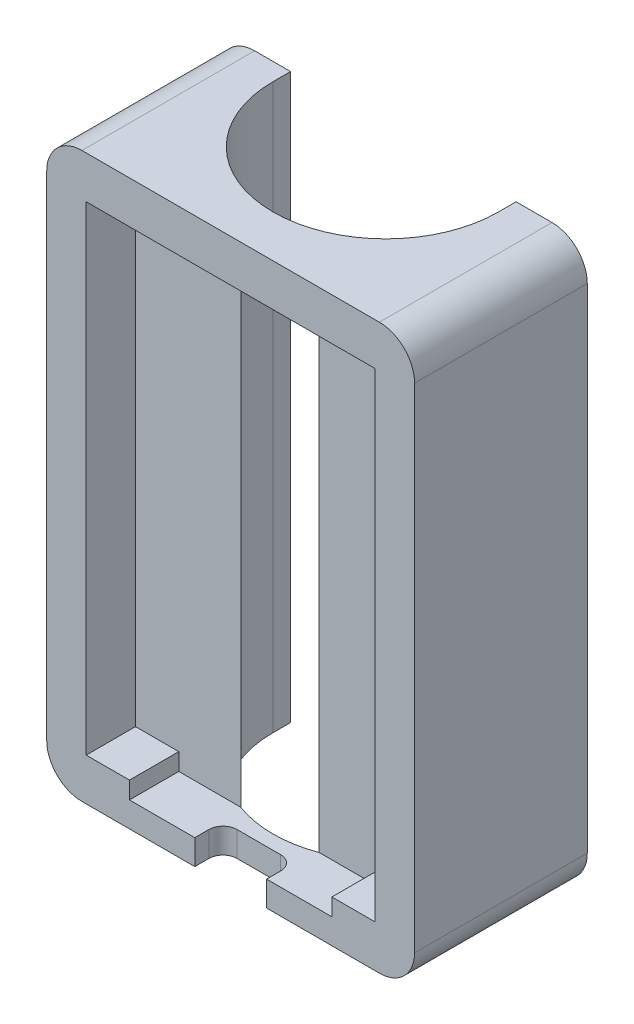
ISO-10303-21;
HEADER;
FILE_DESCRIPTION(('STEP AP214'),'2;1');
FILE_NAME('part.step','',(''),(''),'','','');
FILE_SCHEMA(('AUTOMOTIVE_DESIGN { 1 0 10303 214 1 1 1 1 }'));
ENDSEC;
DATA;
#1=APPLICATION_CONTEXT('core data for automotive mechanical design processes');
#2=APPLICATION_PROTOCOL_DEFINITION('international standard','automotive_design',2000,#1);
#3=PRODUCT_CONTEXT('',#1,'mechanical');
#4=PRODUCT('Part','Part','',(#3));
#5=PRODUCT_RELATED_PRODUCT_CATEGORY('part','',(#4));
#6=PRODUCT_DEFINITION_FORMATION('','',#4);
#7=PRODUCT_DEFINITION_CONTEXT('part definition',#1,'design');
#8=PRODUCT_DEFINITION('design','',#6,#7);
#9=PRODUCT_DEFINITION_SHAPE('','',#8);
#10=(LENGTH_UNIT() NAMED_UNIT(*) SI_UNIT(.MILLI.,.METRE.));
#11=(NAMED_UNIT(*) PLANE_ANGLE_UNIT() SI_UNIT($,.RADIAN.));
#12=(NAMED_UNIT(*) SI_UNIT($,.STERADIAN.) SOLID_ANGLE_UNIT());
#13=UNCERTAINTY_MEASURE_WITH_UNIT(LENGTH_MEASURE(1.E-05),#10,'distance_accuracy_value','');
#14=(GEOMETRIC_REPRESENTATION_CONTEXT(3) GLOBAL_UNCERTAINTY_ASSIGNED_CONTEXT((#13)) GLOBAL_UNIT_ASSIGNED_CONTEXT((#10,
#11,#12)) REPRESENTATION_CONTEXT('',''));
#15=CARTESIAN_POINT('',(0.,0.,0.));
#16=DIRECTION('',(0.,0.,1.));
#17=DIRECTION('',(1.,0.,0.));
#18=AXIS2_PLACEMENT_3D('',#15,#16,#17);
#19=CARTESIAN_POINT('',(-41.2247953621848,-2.00646090534981,22.));
#20=DIRECTION('',(1.,0.,0.));
#21=DIRECTION('',(0.,0.,-1.));
#22=AXIS2_PLACEMENT_3D('',#19,#20,#21);
#23=PLANE('',#22);
#24=DIRECTION('',(0.,1.,0.));
#25=VECTOR('',#24,1.);
#26=CARTESIAN_POINT('',(-41.2247953621848,-2.00646090534981,-2.5));
#27=LINE('',#26,#25);
#28=CARTESIAN_POINT('',(-41.2247953621848,-77.0064609053498,-2.5));
#29=VERTEX_POINT('',#28);
#30=CARTESIAN_POINT('',(-41.2247953621848,-7.00646090534981,-2.5));
#31=VERTEX_POINT('',#30);
#32=EDGE_CURVE('E271',#29,#31,#27,.T.);
#33=ORIENTED_EDGE('',*,*,#32,.F.);
#34=DIRECTION('',(0.,0.,-1.));
#35=VECTOR('',#34,1.);
#36=CARTESIAN_POINT('',(-41.2247953621848,-77.0064609053498,22.));
#37=LINE('',#36,#35);
#38=CARTESIAN_POINT('',(-41.2247953621848,-77.0064609053498,22.));
#39=VERTEX_POINT('',#38);
#40=EDGE_CURVE('E11',#29,#39,#37,.F.);
#41=ORIENTED_EDGE('',*,*,#40,.T.);
#42=DIRECTION('',(0.,-1.,0.));
#43=VECTOR('',#42,1.);
#44=CARTESIAN_POINT('',(-41.2247953621848,-2.00646090534981,22.));
#45=LINE('',#44,#43);
#46=CARTESIAN_POINT('',(-41.2247953621848,-7.00646090534981,22.));
#47=VERTEX_POINT('',#46);
#48=EDGE_CURVE('E360',#47,#39,#45,.T.);
#49=ORIENTED_EDGE('',*,*,#48,.F.);
#50=DIRECTION('',(0.,0.,-1.));
#51=VECTOR('',#50,1.);
#52=CARTESIAN_POINT('',(-41.2247953621848,-7.00646090534981,22.));
#53=LINE('',#52,#51);
#54=EDGE_CURVE('E48',#47,#31,#53,.T.);
#55=ORIENTED_EDGE('',*,*,#54,.T.);
#56=EDGE_LOOP('',(#33,#41,#49,#55));
#57=FACE_BOUND('',#56,.T.);
#58=ADVANCED_FACE('F40',(#57),#23,.F.);
#59=CARTESIAN_POINT('',(-41.2247953621848,-82.0064609053498,22.));
#60=DIRECTION('',(0.,1.,0.));
#61=DIRECTION('',(0.,0.,1.));
#62=AXIS2_PLACEMENT_3D('',#59,#60,#61);
#63=PLANE('',#62);
#64=DIRECTION('',(-1.,0.,0.));
#65=VECTOR('',#64,1.);
#66=CARTESIAN_POINT('',(10.9752046378151,-82.0064609053498,-2.5));
#67=LINE('',#66,#65);
#68=CARTESIAN_POINT('',(5.97520463781516,-82.0064609053498,-2.5));
#69=VERTEX_POINT('',#68);
#70=CARTESIAN_POINT('',(0.875204637815156,-82.0064609053498,-2.5));
#71=VERTEX_POINT('',#70);
#72=EDGE_CURVE('E261',#69,#71,#67,.T.);
#73=ORIENTED_EDGE('',*,*,#72,.F.);
#74=DIRECTION('',(0.,0.,-1.));
#75=VECTOR('',#74,1.);
#76=CARTESIAN_POINT('',(5.97520463781516,-82.0064609053498,22.));
#77=LINE('',#76,#75);
#78=CARTESIAN_POINT('',(5.97520463781516,-82.0064609053498,22.));
#79=VERTEX_POINT('',#78);
#80=EDGE_CURVE('E431',#69,#79,#77,.F.);
#81=ORIENTED_EDGE('',*,*,#80,.T.);
#82=DIRECTION('',(1.,0.,0.));
#83=VECTOR('',#82,1.);
#84=CARTESIAN_POINT('',(-41.2247953621848,-82.0064609053498,22.));
#85=LINE('',#84,#83);
#86=CARTESIAN_POINT('',(-10.0297953621848,-82.0064609053498,22.));
#87=VERTEX_POINT('',#86);
#88=EDGE_CURVE('E363',#87,#79,#85,.T.);
#89=ORIENTED_EDGE('',*,*,#88,.F.);
#90=DIRECTION('',(0.,0.,1.));
#91=VECTOR('',#90,1.);
#92=CARTESIAN_POINT('',(-10.0297953621848,-82.0064609053498,18.));
#93=LINE('',#92,#91);
#94=CARTESIAN_POINT('',(-10.0297953621848,-82.0064609053498,20.));
#95=VERTEX_POINT('',#94);
#96=EDGE_CURVE('E298',#95,#87,#93,.T.);
#97=ORIENTED_EDGE('',*,*,#96,.F.);
#98=CARTESIAN_POINT('',(-12.0297953621848,-82.0064609053498,20.));
#99=DIRECTION('',(0.,1.,0.));
#100=DIRECTION('',(0.,0.,1.));
#101=AXIS2_PLACEMENT_3D('',#98,#99,#100);
#102=CIRCLE('',#101,2.);
#103=CARTESIAN_POINT('',(-12.0297953621848,-82.0064609053498,18.));
#104=VERTEX_POINT('',#103);
#105=EDGE_CURVE('E401',#95,#104,#102,.T.);
#106=ORIENTED_EDGE('',*,*,#105,.T.);
#107=DIRECTION('',(1.,0.,0.));
#108=VECTOR('',#107,1.);
#109=CARTESIAN_POINT('',(-20.2197953621848,-82.0064609053498,18.));
#110=LINE('',#109,#108);
#111=CARTESIAN_POINT('',(-18.2197953621848,-82.0064609053498,18.));
#112=VERTEX_POINT('',#111);
#113=EDGE_CURVE('E281',#112,#104,#110,.T.);
#114=ORIENTED_EDGE('',*,*,#113,.F.);
#115=CARTESIAN_POINT('',(-18.2197953621848,-82.0064609053498,20.));
#116=DIRECTION('',(0.,1.,0.));
#117=DIRECTION('',(0.,0.,1.));
#118=AXIS2_PLACEMENT_3D('',#115,#116,#117);
#119=CIRCLE('',#118,2.);
#120=CARTESIAN_POINT('',(-20.2197953621848,-82.0064609053498,20.));
#121=VERTEX_POINT('',#120);
#122=EDGE_CURVE('E403',#112,#121,#119,.T.);
#123=ORIENTED_EDGE('',*,*,#122,.T.);
#124=DIRECTION('',(0.,0.,1.));
#125=VECTOR('',#124,1.);
#126=CARTESIAN_POINT('',(-20.2197953621848,-82.0064609053498,18.));
#127=LINE('',#126,#125);
#128=CARTESIAN_POINT('',(-20.2197953621848,-82.0064609053498,22.));
#129=VERTEX_POINT('',#128);
#130=EDGE_CURVE('E288',#121,#129,#127,.T.);
#131=ORIENTED_EDGE('',*,*,#130,.T.);
#132=CARTESIAN_POINT('',(-36.2247953621848,-82.0064609053498,22.));
#133=VERTEX_POINT('',#132);
#134=EDGE_CURVE('E364',#133,#129,#85,.T.);
#135=ORIENTED_EDGE('',*,*,#134,.F.);
#136=DIRECTION('',(0.,0.,-1.));
#137=VECTOR('',#136,1.);
#138=CARTESIAN_POINT('',(-36.2247953621848,-82.0064609053498,22.));
#139=LINE('',#138,#137);
#140=CARTESIAN_POINT('',(-36.2247953621848,-82.0064609053498,-2.5));
#141=VERTEX_POINT('',#140);
#142=EDGE_CURVE('E428',#133,#141,#139,.T.);
#143=ORIENTED_EDGE('',*,*,#142,.T.);
#144=DIRECTION('',(-1.,0.,0.));
#145=VECTOR('',#144,1.);
#146=CARTESIAN_POINT('',(-31.1247953621848,-82.0064609053498,-2.5));
#147=LINE('',#146,#145);
#148=CARTESIAN_POINT('',(-31.1247953621848,-82.0064609053498,-2.5));
#149=VERTEX_POINT('',#148);
#150=EDGE_CURVE('E269',#149,#141,#147,.T.);
#151=ORIENTED_EDGE('',*,*,#150,.F.);
#152=DIRECTION('',(0.,0.,1.));
#153=VECTOR('',#152,1.);
#154=CARTESIAN_POINT('',(-31.1247953621848,-82.0064609053498,-2.5));
#155=LINE('',#154,#153);
#156=CARTESIAN_POINT('',(-31.1247953621848,-82.0064609053498,0.));
#157=VERTEX_POINT('',#156);
#158=EDGE_CURVE('E277',#149,#157,#155,.T.);
#159=ORIENTED_EDGE('',*,*,#158,.T.);
#160=CARTESIAN_POINT('',(-15.1247953621848,-82.0064609053498,0.));
#161=DIRECTION('',(0.,-1.,0.));
#162=DIRECTION('',(0.,0.,-1.));
#163=AXIS2_PLACEMENT_3D('',#160,#161,#162);
#164=CIRCLE('',#163,16.);
#165=CARTESIAN_POINT('',(0.875204637815156,-82.0064609053498,0.));
#166=VERTEX_POINT('',#165);
#167=EDGE_CURVE('E237',#166,#157,#164,.T.);
#168=ORIENTED_EDGE('',*,*,#167,.F.);
#169=DIRECTION('',(0.,0.,1.));
#170=VECTOR('',#169,1.);
#171=CARTESIAN_POINT('',(0.875204637815156,-82.0064609053498,-2.5));
#172=LINE('',#171,#170);
#173=EDGE_CURVE('E247',#71,#166,#172,.T.);
#174=ORIENTED_EDGE('',*,*,#173,.F.);
#175=EDGE_LOOP('',(#73,#81,#89,#97,#106,#114,#123,#131,#135,#143,#151,#159,#168,#174));
#176=FACE_BOUND('',#175,.T.);
#177=ADVANCED_FACE('F462',(#176),#63,.F.);
#178=CARTESIAN_POINT('',(10.9752046378151,-2.00646090534981,22.));
#179=DIRECTION('',(-1.,0.,0.));
#180=DIRECTION('',(0.,-1.,0.));
#181=AXIS2_PLACEMENT_3D('',#178,#179,#180);
#182=PLANE('',#181);
#183=DIRECTION('',(0.,-1.,0.));
#184=VECTOR('',#183,1.);
#185=CARTESIAN_POINT('',(10.9752046378151,-2.00646090534981,-2.5));
#186=LINE('',#185,#184);
#187=CARTESIAN_POINT('',(10.9752046378151,-7.00646090534981,-2.5));
#188=VERTEX_POINT('',#187);
#189=CARTESIAN_POINT('',(10.9752046378151,-77.0064609053498,-2.5));
#190=VERTEX_POINT('',#189);
#191=EDGE_CURVE('E263',#188,#190,#186,.T.);
#192=ORIENTED_EDGE('',*,*,#191,.F.);
#193=DIRECTION('',(0.,0.,-1.));
#194=VECTOR('',#193,1.);
#195=CARTESIAN_POINT('',(10.9752046378151,-7.00646090534981,22.));
#196=LINE('',#195,#194);
#197=CARTESIAN_POINT('',(10.9752046378151,-7.00646090534981,22.));
#198=VERTEX_POINT('',#197);
#199=EDGE_CURVE('E418',#188,#198,#196,.F.);
#200=ORIENTED_EDGE('',*,*,#199,.T.);
#201=DIRECTION('',(0.,1.,0.));
#202=VECTOR('',#201,1.);
#203=CARTESIAN_POINT('',(10.9752046378151,-2.00646090534981,22.));
#204=LINE('',#203,#202);
#205=CARTESIAN_POINT('',(10.9752046378152,-77.0064609053498,22.));
#206=VERTEX_POINT('',#205);
#207=EDGE_CURVE('E366',#206,#198,#204,.T.);
#208=ORIENTED_EDGE('',*,*,#207,.F.);
#209=DIRECTION('',(0.,0.,-1.));
#210=VECTOR('',#209,1.);
#211=CARTESIAN_POINT('',(10.9752046378152,-77.0064609053498,22.));
#212=LINE('',#211,#210);
#213=EDGE_CURVE('E415',#206,#190,#212,.T.);
#214=ORIENTED_EDGE('',*,*,#213,.T.);
#215=EDGE_LOOP('',(#192,#200,#208,#214));
#216=FACE_BOUND('',#215,.T.);
#217=ADVANCED_FACE('F453',(#216),#182,.F.);
#218=CARTESIAN_POINT('',(-41.2247953621848,-2.00646090534981,22.));
#219=DIRECTION('',(0.,-1.,0.));
#220=DIRECTION('',(0.,0.,-1.));
#221=AXIS2_PLACEMENT_3D('',#218,#219,#220);
#222=PLANE('',#221);
#223=DIRECTION('',(-1.,0.,0.));
#224=VECTOR('',#223,1.);
#225=CARTESIAN_POINT('',(-41.2247953621848,-2.00646090534981,22.));
#226=LINE('',#225,#224);
#227=CARTESIAN_POINT('',(5.97520463781515,-2.00646090534981,22.));
#228=VERTEX_POINT('',#227);
#229=CARTESIAN_POINT('',(-36.2247953621848,-2.00646090534981,22.));
#230=VERTEX_POINT('',#229);
#231=EDGE_CURVE('E369',#228,#230,#226,.T.);
#232=ORIENTED_EDGE('',*,*,#231,.F.);
#233=DIRECTION('',(0.,0.,-1.));
#234=VECTOR('',#233,1.);
#235=CARTESIAN_POINT('',(5.97520463781515,-2.00646090534981,22.));
#236=LINE('',#235,#234);
#237=CARTESIAN_POINT('',(5.97520463781515,-2.00646090534981,-2.5));
#238=VERTEX_POINT('',#237);
#239=EDGE_CURVE('E409',#228,#238,#236,.T.);
#240=ORIENTED_EDGE('',*,*,#239,.T.);
#241=DIRECTION('',(1.,0.,0.));
#242=VECTOR('',#241,1.);
#243=CARTESIAN_POINT('',(10.9752046378151,-2.00646090534981,-2.5));
#244=LINE('',#243,#242);
#245=CARTESIAN_POINT('',(0.875204637815156,-2.00646090534981,-2.5));
#246=VERTEX_POINT('',#245);
#247=EDGE_CURVE('E254',#246,#238,#244,.T.);
#248=ORIENTED_EDGE('',*,*,#247,.F.);
#249=DIRECTION('',(0.,0.,1.));
#250=VECTOR('',#249,1.);
#251=CARTESIAN_POINT('',(0.875204637815156,-2.00646090534981,-2.5));
#252=LINE('',#251,#250);
#253=CARTESIAN_POINT('',(0.875204637815156,-2.00646090534981,0.));
#254=VERTEX_POINT('',#253);
#255=EDGE_CURVE('E244',#246,#254,#252,.T.);
#256=ORIENTED_EDGE('',*,*,#255,.T.);
#257=CARTESIAN_POINT('',(-15.1247953621848,-2.00646090534981,0.));
#258=DIRECTION('',(0.,-1.,0.));
#259=DIRECTION('',(0.,0.,-1.));
#260=AXIS2_PLACEMENT_3D('',#257,#258,#259);
#261=CIRCLE('',#260,16.);
#262=CARTESIAN_POINT('',(-31.1247953621848,-2.00646090534981,0.));
#263=VERTEX_POINT('',#262);
#264=EDGE_CURVE('E225',#254,#263,#261,.T.);
#265=ORIENTED_EDGE('',*,*,#264,.T.);
#266=DIRECTION('',(0.,0.,1.));
#267=VECTOR('',#266,1.);
#268=CARTESIAN_POINT('',(-31.1247953621848,-2.00646090534981,-2.5));
#269=LINE('',#268,#267);
#270=CARTESIAN_POINT('',(-31.1247953621848,-2.00646090534981,-2.5));
#271=VERTEX_POINT('',#270);
#272=EDGE_CURVE('E275',#271,#263,#269,.T.);
#273=ORIENTED_EDGE('',*,*,#272,.F.);
#274=DIRECTION('',(1.,0.,0.));
#275=VECTOR('',#274,1.);
#276=CARTESIAN_POINT('',(-31.1247953621848,-2.00646090534981,-2.5));
#277=LINE('',#276,#275);
#278=CARTESIAN_POINT('',(-36.2247953621848,-2.00646090534981,-2.5));
#279=VERTEX_POINT('',#278);
#280=EDGE_CURVE('E273',#279,#271,#277,.T.);
#281=ORIENTED_EDGE('',*,*,#280,.F.);
#282=DIRECTION('',(0.,0.,-1.));
#283=VECTOR('',#282,1.);
#284=CARTESIAN_POINT('',(-36.2247953621848,-2.00646090534981,22.));
#285=LINE('',#284,#283);
#286=EDGE_CURVE('E407',#279,#230,#285,.F.);
#287=ORIENTED_EDGE('',*,*,#286,.T.);
#288=EDGE_LOOP('',(#232,#240,#248,#256,#265,#273,#281,#287));
#289=FACE_BOUND('',#288,.T.);
#290=ADVANCED_FACE('F251',(#289),#222,.F.);
#291=CARTESIAN_POINT('',(0.,0.,22.));
#292=DIRECTION('',(0.,0.,1.));
#293=DIRECTION('',(1.,0.,0.));
#294=AXIS2_PLACEMENT_3D('',#291,#292,#293);
#295=PLANE('',#294);
#296=ORIENTED_EDGE('',*,*,#207,.T.);
#297=CARTESIAN_POINT('',(5.97520463781515,-7.00646090534981,22.));
#298=DIRECTION('',(0.,0.,1.));
#299=DIRECTION('',(1.,0.,0.));
#300=AXIS2_PLACEMENT_3D('',#297,#298,#299);
#301=CIRCLE('',#300,5.);
#302=EDGE_CURVE('E426',#198,#228,#301,.T.);
#303=ORIENTED_EDGE('',*,*,#302,.T.);
#304=ORIENTED_EDGE('',*,*,#231,.T.);
#305=CARTESIAN_POINT('',(-36.2247953621848,-7.00646090534981,22.));
#306=DIRECTION('',(0.,0.,1.));
#307=DIRECTION('',(1.,0.,0.));
#308=AXIS2_PLACEMENT_3D('',#305,#306,#307);
#309=CIRCLE('',#308,5.);
#310=EDGE_CURVE('E420',#230,#47,#309,.T.);
#311=ORIENTED_EDGE('',*,*,#310,.T.);
#312=ORIENTED_EDGE('',*,*,#48,.T.);
#313=CARTESIAN_POINT('',(-36.2247953621848,-77.0064609053498,22.));
#314=DIRECTION('',(0.,0.,1.));
#315=DIRECTION('',(1.,0.,0.));
#316=AXIS2_PLACEMENT_3D('',#313,#314,#315);
#317=CIRCLE('',#316,5.);
#318=EDGE_CURVE('E422',#39,#133,#317,.T.);
#319=ORIENTED_EDGE('',*,*,#318,.T.);
#320=ORIENTED_EDGE('',*,*,#134,.T.);
#321=DIRECTION('',(0.,-1.,0.));
#322=VECTOR('',#321,1.);
#323=CARTESIAN_POINT('',(-20.2197953621848,-78.4452609053498,22.));
#324=LINE('',#323,#322);
#325=CARTESIAN_POINT('',(-20.2197953621848,-78.4452609053498,22.));
#326=VERTEX_POINT('',#325);
#327=EDGE_CURVE('E280',#326,#129,#324,.T.);
#328=ORIENTED_EDGE('',*,*,#327,.F.);
#329=DIRECTION('',(1.,0.,0.));
#330=VECTOR('',#329,1.);
#331=CARTESIAN_POINT('',(-39.4847953621848,-78.4452609053498,22.));
#332=LINE('',#331,#330);
#333=CARTESIAN_POINT('',(-29.4847953621848,-78.4452609053498,22.));
#334=VERTEX_POINT('',#333);
#335=EDGE_CURVE('E357',#334,#326,#332,.T.);
#336=ORIENTED_EDGE('',*,*,#335,.F.);
#337=DIRECTION('',(0.,1.,0.));
#338=VECTOR('',#337,1.);
#339=CARTESIAN_POINT('',(-29.4847953621849,0.,22.));
#340=LINE('',#339,#338);
#341=CARTESIAN_POINT('',(-29.4847953621849,-76.0064609053498,22.));
#342=VERTEX_POINT('',#341);
#343=EDGE_CURVE('E339',#334,#342,#340,.T.);
#344=ORIENTED_EDGE('',*,*,#343,.T.);
#345=DIRECTION('',(1.,0.,0.));
#346=VECTOR('',#345,1.);
#347=CARTESIAN_POINT('',(0.,-76.0064609053498,22.));
#348=LINE('',#347,#346);
#349=CARTESIAN_POINT('',(-35.6247953621848,-76.0064609053498,22.));
#350=VERTEX_POINT('',#349);
#351=EDGE_CURVE('E341',#350,#342,#348,.T.);
#352=ORIENTED_EDGE('',*,*,#351,.F.);
#353=DIRECTION('',(0.,-1.,0.));
#354=VECTOR('',#353,1.);
#355=CARTESIAN_POINT('',(-35.6247953621848,0.,22.));
#356=LINE('',#355,#354);
#357=CARTESIAN_POINT('',(-35.6247953621848,-8.00646090534981,22.));
#358=VERTEX_POINT('',#357);
#359=EDGE_CURVE('E236',#358,#350,#356,.T.);
#360=ORIENTED_EDGE('',*,*,#359,.F.);
#361=DIRECTION('',(1.,0.,0.));
#362=VECTOR('',#361,1.);
#363=CARTESIAN_POINT('',(0.,-8.00646090534981,22.));
#364=LINE('',#363,#362);
#365=CARTESIAN_POINT('',(5.37520463781516,-8.00646090534981,22.));
#366=VERTEX_POINT('',#365);
#367=EDGE_CURVE('E329',#358,#366,#364,.T.);
#368=ORIENTED_EDGE('',*,*,#367,.T.);
#369=DIRECTION('',(0.,-1.,0.));
#370=VECTOR('',#369,1.);
#371=CARTESIAN_POINT('',(5.37520463781516,0.,22.));
#372=LINE('',#371,#370);
#373=CARTESIAN_POINT('',(5.37520463781517,-76.0064609053498,22.));
#374=VERTEX_POINT('',#373);
#375=EDGE_CURVE('E331',#366,#374,#372,.T.);
#376=ORIENTED_EDGE('',*,*,#375,.T.);
#377=DIRECTION('',(1.,0.,0.));
#378=VECTOR('',#377,1.);
#379=CARTESIAN_POINT('',(0.,-76.0064609053498,22.));
#380=LINE('',#379,#378);
#381=CARTESIAN_POINT('',(-0.764795362184795,-76.0064609053498,22.));
#382=VERTEX_POINT('',#381);
#383=EDGE_CURVE('E333',#382,#374,#380,.T.);
#384=ORIENTED_EDGE('',*,*,#383,.F.);
#385=DIRECTION('',(0.,1.,0.));
#386=VECTOR('',#385,1.);
#387=CARTESIAN_POINT('',(-0.764795362184795,0.,22.));
#388=LINE('',#387,#386);
#389=CARTESIAN_POINT('',(-0.764795362184837,-78.4452609053498,22.));
#390=VERTEX_POINT('',#389);
#391=EDGE_CURVE('E336',#390,#382,#388,.T.);
#392=ORIENTED_EDGE('',*,*,#391,.F.);
#393=CARTESIAN_POINT('',(-10.0297953621848,-78.4452609053498,22.));
#394=VERTEX_POINT('',#393);
#395=EDGE_CURVE('E356',#394,#390,#332,.T.);
#396=ORIENTED_EDGE('',*,*,#395,.F.);
#397=DIRECTION('',(0.,1.,0.));
#398=VECTOR('',#397,1.);
#399=CARTESIAN_POINT('',(-10.0297953621848,-78.4452609053498,22.));
#400=LINE('',#399,#398);
#401=EDGE_CURVE('E285',#87,#394,#400,.T.);
#402=ORIENTED_EDGE('',*,*,#401,.F.);
#403=ORIENTED_EDGE('',*,*,#88,.T.);
#404=CARTESIAN_POINT('',(5.97520463781516,-77.0064609053498,22.));
#405=DIRECTION('',(0.,0.,1.));
#406=DIRECTION('',(1.,0.,0.));
#407=AXIS2_PLACEMENT_3D('',#404,#405,#406);
#408=CIRCLE('',#407,5.);
#409=EDGE_CURVE('E424',#79,#206,#408,.T.);
#410=ORIENTED_EDGE('',*,*,#409,.T.);
#411=EDGE_LOOP('',(#296,#303,#304,#311,#312,#319,#320,#328,#336,#344,#352,#360,#368,#376,#384,
#392,#396,#402,#403,#410));
#412=FACE_BOUND('',#411,.T.);
#413=ADVANCED_FACE('F442',(#412),#295,.T.);
#414=CARTESIAN_POINT('',(-39.4847953621848,-78.4452609053498,17.));
#415=DIRECTION('',(0.,-1.,0.));
#416=DIRECTION('',(0.,0.,-1.));
#417=AXIS2_PLACEMENT_3D('',#414,#415,#416);
#418=PLANE('',#417);
#419=ORIENTED_EDGE('',*,*,#335,.T.);
#420=DIRECTION('',(0.,0.,1.));
#421=VECTOR('',#420,1.);
#422=CARTESIAN_POINT('',(-20.2197953621848,-78.4452609053498,18.));
#423=LINE('',#422,#421);
#424=CARTESIAN_POINT('',(-20.2197953621848,-78.4452609053498,20.));
#425=VERTEX_POINT('',#424);
#426=EDGE_CURVE('E293',#425,#326,#423,.T.);
#427=ORIENTED_EDGE('',*,*,#426,.F.);
#428=CARTESIAN_POINT('',(-18.2197953621848,-78.4452609053498,20.));
#429=DIRECTION('',(0.,-1.,0.));
#430=DIRECTION('',(0.,0.,-1.));
#431=AXIS2_PLACEMENT_3D('',#428,#429,#430);
#432=CIRCLE('',#431,2.);
#433=CARTESIAN_POINT('',(-18.2197953621848,-78.4452609053498,18.));
#434=VERTEX_POINT('',#433);
#435=EDGE_CURVE('E405',#425,#434,#432,.T.);
#436=ORIENTED_EDGE('',*,*,#435,.T.);
#437=DIRECTION('',(-1.,0.,0.));
#438=VECTOR('',#437,1.);
#439=CARTESIAN_POINT('',(-20.2197953621848,-78.4452609053498,18.));
#440=LINE('',#439,#438);
#441=CARTESIAN_POINT('',(-12.0297953621848,-78.4452609053498,18.));
#442=VERTEX_POINT('',#441);
#443=EDGE_CURVE('E284',#442,#434,#440,.T.);
#444=ORIENTED_EDGE('',*,*,#443,.F.);
#445=CARTESIAN_POINT('',(-12.0297953621848,-78.4452609053498,20.));
#446=DIRECTION('',(0.,-1.,0.));
#447=DIRECTION('',(0.,0.,-1.));
#448=AXIS2_PLACEMENT_3D('',#445,#446,#447);
#449=CIRCLE('',#448,2.);
#450=CARTESIAN_POINT('',(-10.0297953621848,-78.4452609053498,20.));
#451=VERTEX_POINT('',#450);
#452=EDGE_CURVE('E399',#442,#451,#449,.T.);
#453=ORIENTED_EDGE('',*,*,#452,.T.);
#454=DIRECTION('',(0.,0.,1.));
#455=VECTOR('',#454,1.);
#456=CARTESIAN_POINT('',(-10.0297953621848,-78.4452609053498,18.));
#457=LINE('',#456,#455);
#458=EDGE_CURVE('E296',#451,#394,#457,.T.);
#459=ORIENTED_EDGE('',*,*,#458,.T.);
#460=ORIENTED_EDGE('',*,*,#395,.T.);
#461=DIRECTION('',(0.,0.,1.));
#462=VECTOR('',#461,1.);
#463=CARTESIAN_POINT('',(-0.764795362184836,-78.4452609053498,17.));
#464=LINE('',#463,#462);
#465=CARTESIAN_POINT('',(-0.764795362184837,-78.4452609053498,15.));
#466=VERTEX_POINT('',#465);
#467=EDGE_CURVE('E372',#390,#466,#464,.F.);
#468=ORIENTED_EDGE('',*,*,#467,.T.);
#469=DIRECTION('',(1.,0.,0.));
#470=VECTOR('',#469,1.);
#471=CARTESIAN_POINT('',(-0.764795362184837,-78.4452609053498,15.));
#472=LINE('',#471,#470);
#473=CARTESIAN_POINT('',(-9.55703099935482,-78.4452609053498,15.));
#474=VERTEX_POINT('',#473);
#475=EDGE_CURVE('E310',#474,#466,#472,.T.);
#476=ORIENTED_EDGE('',*,*,#475,.F.);
#477=CARTESIAN_POINT('',(-15.1247953621848,-78.4452609053498,0.));
#478=DIRECTION('',(0.,-1.,0.));
#479=DIRECTION('',(0.,0.,-1.));
#480=AXIS2_PLACEMENT_3D('',#477,#478,#479);
#481=CIRCLE('',#480,16.);
#482=CARTESIAN_POINT('',(-20.6925597250149,-78.4452609053498,15.));
#483=VERTEX_POINT('',#482);
#484=EDGE_CURVE('E380',#483,#474,#481,.F.);
#485=ORIENTED_EDGE('',*,*,#484,.F.);
#486=CARTESIAN_POINT('',(-29.4847953621848,-78.4452609053498,15.));
#487=VERTEX_POINT('',#486);
#488=EDGE_CURVE('E311',#487,#483,#472,.T.);
#489=ORIENTED_EDGE('',*,*,#488,.F.);
#490=DIRECTION('',(0.,0.,1.));
#491=VECTOR('',#490,1.);
#492=CARTESIAN_POINT('',(-29.4847953621848,-78.4452609053498,22.));
#493=LINE('',#492,#491);
#494=EDGE_CURVE('E248',#487,#334,#493,.T.);
#495=ORIENTED_EDGE('',*,*,#494,.T.);
#496=EDGE_LOOP('',(#419,#427,#436,#444,#453,#459,#460,#468,#476,#485,#489,#495));
#497=FACE_BOUND('',#496,.T.);
#498=ADVANCED_FACE('F512',(#497),#418,.F.);
#499=CARTESIAN_POINT('',(-35.6247953621848,0.,22.));
#500=DIRECTION('',(1.,0.,0.));
#501=DIRECTION('',(0.,0.,-1.));
#502=AXIS2_PLACEMENT_3D('',#499,#500,#501);
#503=PLANE('',#502);
#504=DIRECTION('',(0.,0.,-1.));
#505=VECTOR('',#504,1.);
#506=CARTESIAN_POINT('',(-35.6247953621848,-76.0064609053498,22.));
#507=LINE('',#506,#505);
#508=CARTESIAN_POINT('',(-35.6247953621848,-76.0064609053498,15.));
#509=VERTEX_POINT('',#508);
#510=EDGE_CURVE('E344',#350,#509,#507,.T.);
#511=ORIENTED_EDGE('',*,*,#510,.T.);
#512=DIRECTION('',(0.,-1.,0.));
#513=VECTOR('',#512,1.);
#514=CARTESIAN_POINT('',(-35.6247953621848,-76.0064609053498,15.));
#515=LINE('',#514,#513);
#516=CARTESIAN_POINT('',(-35.6247953621848,-8.00646090534981,15.));
#517=VERTEX_POINT('',#516);
#518=EDGE_CURVE('E295',#517,#509,#515,.T.);
#519=ORIENTED_EDGE('',*,*,#518,.F.);
#520=DIRECTION('',(0.,0.,-1.));
#521=VECTOR('',#520,1.);
#522=CARTESIAN_POINT('',(-35.6247953621848,-8.00646090534981,22.));
#523=LINE('',#522,#521);
#524=EDGE_CURVE('E354',#358,#517,#523,.T.);
#525=ORIENTED_EDGE('',*,*,#524,.F.);
#526=ORIENTED_EDGE('',*,*,#359,.T.);
#527=EDGE_LOOP('',(#511,#519,#525,#526));
#528=FACE_BOUND('',#527,.T.);
#529=ADVANCED_FACE('F527',(#528),#503,.T.);
#530=CARTESIAN_POINT('',(0.,-8.00646090534981,22.));
#531=DIRECTION('',(0.,1.,0.));
#532=DIRECTION('',(-1.,0.,0.));
#533=AXIS2_PLACEMENT_3D('',#530,#531,#532);
#534=PLANE('',#533);
#535=ORIENTED_EDGE('',*,*,#524,.T.);
#536=DIRECTION('',(-1.,0.,0.));
#537=VECTOR('',#536,1.);
#538=CARTESIAN_POINT('',(-35.6247953621848,-8.00646090534981,15.));
#539=LINE('',#538,#537);
#540=CARTESIAN_POINT('',(-20.6925597250149,-8.00646090534981,15.));
#541=VERTEX_POINT('',#540);
#542=EDGE_CURVE('E322',#541,#517,#539,.T.);
#543=ORIENTED_EDGE('',*,*,#542,.F.);
#544=CARTESIAN_POINT('',(-15.1247953621848,-8.00646090534981,0.));
#545=DIRECTION('',(0.,1.,0.));
#546=DIRECTION('',(-1.,0.,0.));
#547=AXIS2_PLACEMENT_3D('',#544,#545,#546);
#548=CIRCLE('',#547,16.);
#549=CARTESIAN_POINT('',(-9.55703099935482,-8.00646090534981,15.));
#550=VERTEX_POINT('',#549);
#551=EDGE_CURVE('E383',#550,#541,#548,.F.);
#552=ORIENTED_EDGE('',*,*,#551,.F.);
#553=CARTESIAN_POINT('',(5.37520463781516,-8.00646090534981,15.));
#554=VERTEX_POINT('',#553);
#555=EDGE_CURVE('E323',#554,#550,#539,.T.);
#556=ORIENTED_EDGE('',*,*,#555,.F.);
#557=DIRECTION('',(0.,0.,-1.));
#558=VECTOR('',#557,1.);
#559=CARTESIAN_POINT('',(5.37520463781516,-8.00646090534981,22.));
#560=LINE('',#559,#558);
#561=EDGE_CURVE('E352',#366,#554,#560,.T.);
#562=ORIENTED_EDGE('',*,*,#561,.F.);
#563=ORIENTED_EDGE('',*,*,#367,.F.);
#564=EDGE_LOOP('',(#535,#543,#552,#556,#562,#563));
#565=FACE_BOUND('',#564,.T.);
#566=ADVANCED_FACE('F533',(#565),#534,.F.);
#567=CARTESIAN_POINT('',(5.37520463781516,0.,22.));
#568=DIRECTION('',(1.,0.,0.));
#569=DIRECTION('',(0.,1.,0.));
#570=AXIS2_PLACEMENT_3D('',#567,#568,#569);
#571=PLANE('',#570);
#572=ORIENTED_EDGE('',*,*,#561,.T.);
#573=DIRECTION('',(0.,1.,0.));
#574=VECTOR('',#573,1.);
#575=CARTESIAN_POINT('',(5.37520463781516,-8.00646090534981,15.));
#576=LINE('',#575,#574);
#577=CARTESIAN_POINT('',(5.37520463781517,-76.0064609053498,15.));
#578=VERTEX_POINT('',#577);
#579=EDGE_CURVE('E319',#578,#554,#576,.T.);
#580=ORIENTED_EDGE('',*,*,#579,.F.);
#581=DIRECTION('',(0.,0.,-1.));
#582=VECTOR('',#581,1.);
#583=CARTESIAN_POINT('',(5.37520463781517,-76.0064609053498,22.));
#584=LINE('',#583,#582);
#585=EDGE_CURVE('E350',#374,#578,#584,.T.);
#586=ORIENTED_EDGE('',*,*,#585,.F.);
#587=ORIENTED_EDGE('',*,*,#375,.F.);
#588=EDGE_LOOP('',(#572,#580,#586,#587));
#589=FACE_BOUND('',#588,.T.);
#590=ADVANCED_FACE('F541',(#589),#571,.F.);
#591=CARTESIAN_POINT('',(0.,-76.0064609053498,22.));
#592=DIRECTION('',(0.,1.,0.));
#593=DIRECTION('',(0.,0.,1.));
#594=AXIS2_PLACEMENT_3D('',#591,#592,#593);
#595=PLANE('',#594);
#596=ORIENTED_EDGE('',*,*,#585,.T.);
#597=DIRECTION('',(1.,0.,0.));
#598=VECTOR('',#597,1.);
#599=CARTESIAN_POINT('',(5.37520463781517,-76.0064609053498,15.));
#600=LINE('',#599,#598);
#601=CARTESIAN_POINT('',(-0.764795362184795,-76.0064609053498,15.));
#602=VERTEX_POINT('',#601);
#603=EDGE_CURVE('E316',#602,#578,#600,.T.);
#604=ORIENTED_EDGE('',*,*,#603,.F.);
#605=DIRECTION('',(0.,0.,-1.));
#606=VECTOR('',#605,1.);
#607=CARTESIAN_POINT('',(-0.764795362184795,-76.0064609053498,22.));
#608=LINE('',#607,#606);
#609=EDGE_CURVE('E348',#382,#602,#608,.T.);
#610=ORIENTED_EDGE('',*,*,#609,.F.);
#611=ORIENTED_EDGE('',*,*,#383,.T.);
#612=EDGE_LOOP('',(#596,#604,#610,#611));
#613=FACE_BOUND('',#612,.T.);
#614=ADVANCED_FACE('F544',(#613),#595,.T.);
#615=CARTESIAN_POINT('',(-0.764795362184795,0.,22.));
#616=DIRECTION('',(-1.,0.,0.));
#617=DIRECTION('',(0.,0.,1.));
#618=AXIS2_PLACEMENT_3D('',#615,#616,#617);
#619=PLANE('',#618);
#620=ORIENTED_EDGE('',*,*,#609,.T.);
#621=DIRECTION('',(0.,1.,0.));
#622=VECTOR('',#621,1.);
#623=CARTESIAN_POINT('',(-0.764795362184795,-76.0064609053498,15.));
#624=LINE('',#623,#622);
#625=EDGE_CURVE('E313',#466,#602,#624,.T.);
#626=ORIENTED_EDGE('',*,*,#625,.F.);
#627=ORIENTED_EDGE('',*,*,#467,.F.);
#628=ORIENTED_EDGE('',*,*,#391,.T.);
#629=EDGE_LOOP('',(#620,#626,#627,#628));
#630=FACE_BOUND('',#629,.T.);
#631=ADVANCED_FACE('F547',(#630),#619,.T.);
#632=CARTESIAN_POINT('',(-29.4847953621849,0.,22.));
#633=DIRECTION('',(-1.,0.,0.));
#634=DIRECTION('',(0.,0.,1.));
#635=AXIS2_PLACEMENT_3D('',#632,#633,#634);
#636=PLANE('',#635);
#637=ORIENTED_EDGE('',*,*,#494,.F.);
#638=DIRECTION('',(0.,-1.,0.));
#639=VECTOR('',#638,1.);
#640=CARTESIAN_POINT('',(-29.4847953621848,-78.4452609053498,15.));
#641=LINE('',#640,#639);
#642=CARTESIAN_POINT('',(-29.4847953621849,-76.0064609053498,15.));
#643=VERTEX_POINT('',#642);
#644=EDGE_CURVE('E307',#643,#487,#641,.T.);
#645=ORIENTED_EDGE('',*,*,#644,.F.);
#646=DIRECTION('',(0.,0.,-1.));
#647=VECTOR('',#646,1.);
#648=CARTESIAN_POINT('',(-29.4847953621849,-76.0064609053498,22.));
#649=LINE('',#648,#647);
#650=EDGE_CURVE('E346',#342,#643,#649,.T.);
#651=ORIENTED_EDGE('',*,*,#650,.F.);
#652=ORIENTED_EDGE('',*,*,#343,.F.);
#653=EDGE_LOOP('',(#637,#645,#651,#652));
#654=FACE_BOUND('',#653,.T.);
#655=ADVANCED_FACE('F518',(#654),#636,.F.);
#656=CARTESIAN_POINT('',(0.,-76.0064609053498,22.));
#657=DIRECTION('',(0.,1.,0.));
#658=DIRECTION('',(0.,0.,1.));
#659=AXIS2_PLACEMENT_3D('',#656,#657,#658);
#660=PLANE('',#659);
#661=ORIENTED_EDGE('',*,*,#650,.T.);
#662=DIRECTION('',(1.,0.,0.));
#663=VECTOR('',#662,1.);
#664=CARTESIAN_POINT('',(-29.4847953621849,-76.0064609053498,15.));
#665=LINE('',#664,#663);
#666=EDGE_CURVE('E304',#509,#643,#665,.T.);
#667=ORIENTED_EDGE('',*,*,#666,.F.);
#668=ORIENTED_EDGE('',*,*,#510,.F.);
#669=ORIENTED_EDGE('',*,*,#351,.T.);
#670=EDGE_LOOP('',(#661,#667,#668,#669));
#671=FACE_BOUND('',#670,.T.);
#672=ADVANCED_FACE('F523',(#671),#660,.T.);
#673=CARTESIAN_POINT('',(-15.1247953621848,-2.00646090534981,0.));
#674=DIRECTION('',(0.,-1.,0.));
#675=DIRECTION('',(0.,0.,-1.));
#676=AXIS2_PLACEMENT_3D('',#673,#674,#675);
#677=CYLINDRICAL_SURFACE('',#676,16.);
#678=ORIENTED_EDGE('',*,*,#484,.T.);
#679=DIRECTION('',(0.,-1.,0.));
#680=VECTOR('',#679,1.);
#681=CARTESIAN_POINT('',(-9.55703099935482,-2.00646090534981,15.));
#682=LINE('',#681,#680);
#683=EDGE_CURVE('E386',#474,#550,#682,.F.);
#684=ORIENTED_EDGE('',*,*,#683,.T.);
#685=ORIENTED_EDGE('',*,*,#551,.T.);
#686=DIRECTION('',(0.,-1.,0.));
#687=VECTOR('',#686,1.);
#688=CARTESIAN_POINT('',(-20.6925597250149,-2.00646090534981,15.));
#689=LINE('',#688,#687);
#690=EDGE_CURVE('E377',#541,#483,#689,.T.);
#691=ORIENTED_EDGE('',*,*,#690,.T.);
#692=EDGE_LOOP('',(#678,#684,#685,#691));
#693=FACE_BOUND('',#692,.T.);
#694=ORIENTED_EDGE('',*,*,#264,.F.);
#695=DIRECTION('',(0.,-1.,0.));
#696=VECTOR('',#695,1.);
#697=CARTESIAN_POINT('',(0.875204637815156,-2.00646090534981,0.));
#698=LINE('',#697,#696);
#699=EDGE_CURVE('E228',#166,#254,#698,.F.);
#700=ORIENTED_EDGE('',*,*,#699,.F.);
#701=ORIENTED_EDGE('',*,*,#167,.T.);
#702=DIRECTION('',(0.,-1.,0.));
#703=VECTOR('',#702,1.);
#704=CARTESIAN_POINT('',(-31.1247953621848,-2.00646090534981,0.));
#705=LINE('',#704,#703);
#706=EDGE_CURVE('E231',#263,#157,#705,.T.);
#707=ORIENTED_EDGE('',*,*,#706,.F.);
#708=EDGE_LOOP('',(#694,#700,#701,#707));
#709=FACE_BOUND('',#708,.T.);
#710=ADVANCED_FACE('F227',(#693,#709),#677,.F.);
#711=CARTESIAN_POINT('',(0.,0.,15.));
#712=DIRECTION('',(0.,0.,-1.));
#713=DIRECTION('',(-1.,0.,0.));
#714=AXIS2_PLACEMENT_3D('',#711,#712,#713);
#715=PLANE('',#714);
#716=ORIENTED_EDGE('',*,*,#475,.T.);
#717=ORIENTED_EDGE('',*,*,#625,.T.);
#718=ORIENTED_EDGE('',*,*,#603,.T.);
#719=ORIENTED_EDGE('',*,*,#579,.T.);
#720=ORIENTED_EDGE('',*,*,#555,.T.);
#721=ORIENTED_EDGE('',*,*,#683,.F.);
#722=EDGE_LOOP('',(#716,#717,#718,#719,#720,#721));
#723=FACE_BOUND('',#722,.T.);
#724=ADVANCED_FACE('F572',(#723),#715,.F.);
#725=ORIENTED_EDGE('',*,*,#542,.T.);
#726=ORIENTED_EDGE('',*,*,#518,.T.);
#727=ORIENTED_EDGE('',*,*,#666,.T.);
#728=ORIENTED_EDGE('',*,*,#644,.T.);
#729=ORIENTED_EDGE('',*,*,#488,.T.);
#730=ORIENTED_EDGE('',*,*,#690,.F.);
#731=EDGE_LOOP('',(#725,#726,#727,#728,#729,#730));
#732=FACE_BOUND('',#731,.T.);
#733=ADVANCED_FACE('F571',(#732),#715,.F.);
#734=CARTESIAN_POINT('',(-20.2197953621848,-78.4452609053498,18.));
#735=DIRECTION('',(-1.,0.,0.));
#736=DIRECTION('',(0.,0.,1.));
#737=AXIS2_PLACEMENT_3D('',#734,#735,#736);
#738=PLANE('',#737);
#739=ORIENTED_EDGE('',*,*,#130,.F.);
#740=DIRECTION('',(0.,-1.,0.));
#741=VECTOR('',#740,1.);
#742=CARTESIAN_POINT('',(-20.2197953621848,-78.4452609053498,20.));
#743=LINE('',#742,#741);
#744=EDGE_CURVE('E397',#121,#425,#743,.F.);
#745=ORIENTED_EDGE('',*,*,#744,.T.);
#746=ORIENTED_EDGE('',*,*,#426,.T.);
#747=ORIENTED_EDGE('',*,*,#327,.T.);
#748=EDGE_LOOP('',(#739,#745,#746,#747));
#749=FACE_BOUND('',#748,.T.);
#750=ADVANCED_FACE('F508',(#749),#738,.F.);
#751=CARTESIAN_POINT('',(-10.0297953621848,-78.4452609053498,18.));
#752=DIRECTION('',(1.,0.,0.));
#753=DIRECTION('',(0.,0.,-1.));
#754=AXIS2_PLACEMENT_3D('',#751,#752,#753);
#755=PLANE('',#754);
#756=ORIENTED_EDGE('',*,*,#458,.F.);
#757=DIRECTION('',(0.,1.,0.));
#758=VECTOR('',#757,1.);
#759=CARTESIAN_POINT('',(-10.0297953621848,-78.4452609053498,20.));
#760=LINE('',#759,#758);
#761=EDGE_CURVE('E395',#451,#95,#760,.F.);
#762=ORIENTED_EDGE('',*,*,#761,.T.);
#763=ORIENTED_EDGE('',*,*,#96,.T.);
#764=ORIENTED_EDGE('',*,*,#401,.T.);
#765=EDGE_LOOP('',(#756,#762,#763,#764));
#766=FACE_BOUND('',#765,.T.);
#767=ADVANCED_FACE('F557',(#766),#755,.F.);
#768=CARTESIAN_POINT('',(0.,0.,18.));
#769=DIRECTION('',(0.,0.,1.));
#770=DIRECTION('',(1.,0.,0.));
#771=AXIS2_PLACEMENT_3D('',#768,#769,#770);
#772=PLANE('',#771);
#773=ORIENTED_EDGE('',*,*,#113,.T.);
#774=DIRECTION('',(0.,1.,0.));
#775=VECTOR('',#774,1.);
#776=CARTESIAN_POINT('',(-12.0297953621848,0.,18.));
#777=LINE('',#776,#775);
#778=EDGE_CURVE('E392',#104,#442,#777,.T.);
#779=ORIENTED_EDGE('',*,*,#778,.T.);
#780=ORIENTED_EDGE('',*,*,#443,.T.);
#781=DIRECTION('',(0.,-1.,0.));
#782=VECTOR('',#781,1.);
#783=CARTESIAN_POINT('',(-18.2197953621848,0.,18.));
#784=LINE('',#783,#782);
#785=EDGE_CURVE('E389',#434,#112,#784,.T.);
#786=ORIENTED_EDGE('',*,*,#785,.T.);
#787=EDGE_LOOP('',(#773,#779,#780,#786));
#788=FACE_BOUND('',#787,.T.);
#789=ADVANCED_FACE('F489',(#788),#772,.T.);
#790=CARTESIAN_POINT('',(-12.0297953621848,0.,20.));
#791=DIRECTION('',(0.,1.,0.));
#792=DIRECTION('',(0.,0.,1.));
#793=AXIS2_PLACEMENT_3D('',#790,#791,#792);
#794=CYLINDRICAL_SURFACE('',#793,2.);
#795=ORIENTED_EDGE('',*,*,#105,.F.);
#796=ORIENTED_EDGE('',*,*,#761,.F.);
#797=ORIENTED_EDGE('',*,*,#452,.F.);
#798=ORIENTED_EDGE('',*,*,#778,.F.);
#799=EDGE_LOOP('',(#795,#796,#797,#798));
#800=FACE_BOUND('',#799,.T.);
#801=ADVANCED_FACE('F476',(#800),#794,.F.);
#802=CARTESIAN_POINT('',(-18.2197953621848,0.,20.));
#803=DIRECTION('',(0.,-1.,0.));
#804=DIRECTION('',(0.,0.,-1.));
#805=AXIS2_PLACEMENT_3D('',#802,#803,#804);
#806=CYLINDRICAL_SURFACE('',#805,2.);
#807=ORIENTED_EDGE('',*,*,#435,.F.);
#808=ORIENTED_EDGE('',*,*,#744,.F.);
#809=ORIENTED_EDGE('',*,*,#122,.F.);
#810=ORIENTED_EDGE('',*,*,#785,.F.);
#811=EDGE_LOOP('',(#807,#808,#809,#810));
#812=FACE_BOUND('',#811,.T.);
#813=ADVANCED_FACE('F469',(#812),#806,.F.);
#814=CARTESIAN_POINT('',(-31.1247953621848,-2.00646090534981,-2.5));
#815=DIRECTION('',(-1.,0.,0.));
#816=DIRECTION('',(0.,0.,1.));
#817=AXIS2_PLACEMENT_3D('',#814,#815,#816);
#818=PLANE('',#817);
#819=ORIENTED_EDGE('',*,*,#706,.T.);
#820=ORIENTED_EDGE('',*,*,#158,.F.);
#821=DIRECTION('',(0.,-1.,0.));
#822=VECTOR('',#821,1.);
#823=CARTESIAN_POINT('',(-31.1247953621848,-2.00646090534981,-2.5));
#824=LINE('',#823,#822);
#825=EDGE_CURVE('E266',#271,#149,#824,.T.);
#826=ORIENTED_EDGE('',*,*,#825,.F.);
#827=ORIENTED_EDGE('',*,*,#272,.T.);
#828=EDGE_LOOP('',(#819,#820,#826,#827));
#829=FACE_BOUND('',#828,.T.);
#830=ADVANCED_FACE('F467',(#829),#818,.F.);
#831=CARTESIAN_POINT('',(0.,0.,-2.5));
#832=DIRECTION('',(0.,0.,-1.));
#833=DIRECTION('',(-1.,0.,0.));
#834=AXIS2_PLACEMENT_3D('',#831,#832,#833);
#835=PLANE('',#834);
#836=ORIENTED_EDGE('',*,*,#150,.T.);
#837=CARTESIAN_POINT('',(-36.2247953621848,-77.0064609053498,-2.5));
#838=DIRECTION('',(0.,0.,-1.));
#839=DIRECTION('',(-1.,0.,0.));
#840=AXIS2_PLACEMENT_3D('',#837,#838,#839);
#841=CIRCLE('',#840,5.);
#842=EDGE_CURVE('E63',#141,#29,#841,.T.);
#843=ORIENTED_EDGE('',*,*,#842,.T.);
#844=ORIENTED_EDGE('',*,*,#32,.T.);
#845=CARTESIAN_POINT('',(-36.2247953621848,-7.00646090534981,-2.5));
#846=DIRECTION('',(0.,0.,-1.));
#847=DIRECTION('',(-1.,0.,0.));
#848=AXIS2_PLACEMENT_3D('',#845,#846,#847);
#849=CIRCLE('',#848,5.);
#850=EDGE_CURVE('E55',#31,#279,#849,.T.);
#851=ORIENTED_EDGE('',*,*,#850,.T.);
#852=ORIENTED_EDGE('',*,*,#280,.T.);
#853=ORIENTED_EDGE('',*,*,#825,.T.);
#854=EDGE_LOOP('',(#836,#843,#844,#851,#852,#853));
#855=FACE_BOUND('',#854,.T.);
#856=ADVANCED_FACE('F438',(#855),#835,.T.);
#857=CARTESIAN_POINT('',(0.875204637815156,-2.00646090534981,-2.5));
#858=DIRECTION('',(1.,0.,0.));
#859=DIRECTION('',(0.,0.,-1.));
#860=AXIS2_PLACEMENT_3D('',#857,#858,#859);
#861=PLANE('',#860);
#862=ORIENTED_EDGE('',*,*,#699,.T.);
#863=ORIENTED_EDGE('',*,*,#255,.F.);
#864=DIRECTION('',(0.,1.,0.));
#865=VECTOR('',#864,1.);
#866=CARTESIAN_POINT('',(0.875204637815156,-2.00646090534981,-2.5));
#867=LINE('',#866,#865);
#868=EDGE_CURVE('E256',#71,#246,#867,.T.);
#869=ORIENTED_EDGE('',*,*,#868,.F.);
#870=ORIENTED_EDGE('',*,*,#173,.T.);
#871=EDGE_LOOP('',(#862,#863,#869,#870));
#872=FACE_BOUND('',#871,.T.);
#873=ADVANCED_FACE('F242',(#872),#861,.F.);
#874=CARTESIAN_POINT('',(0.,0.,-2.5));
#875=DIRECTION('',(0.,0.,-1.));
#876=DIRECTION('',(-1.,0.,0.));
#877=AXIS2_PLACEMENT_3D('',#874,#875,#876);
#878=PLANE('',#877);
#879=ORIENTED_EDGE('',*,*,#247,.T.);
#880=CARTESIAN_POINT('',(5.97520463781515,-7.00646090534981,-2.5));
#881=DIRECTION('',(0.,0.,-1.));
#882=DIRECTION('',(-1.,0.,0.));
#883=AXIS2_PLACEMENT_3D('',#880,#881,#882);
#884=CIRCLE('',#883,5.);
#885=EDGE_CURVE('E413',#238,#188,#884,.T.);
#886=ORIENTED_EDGE('',*,*,#885,.T.);
#887=ORIENTED_EDGE('',*,*,#191,.T.);
#888=CARTESIAN_POINT('',(5.97520463781516,-77.0064609053498,-2.5));
#889=DIRECTION('',(0.,0.,-1.));
#890=DIRECTION('',(-1.,0.,0.));
#891=AXIS2_PLACEMENT_3D('',#888,#889,#890);
#892=CIRCLE('',#891,5.);
#893=EDGE_CURVE('E411',#190,#69,#892,.T.);
#894=ORIENTED_EDGE('',*,*,#893,.T.);
#895=ORIENTED_EDGE('',*,*,#72,.T.);
#896=ORIENTED_EDGE('',*,*,#868,.T.);
#897=EDGE_LOOP('',(#879,#886,#887,#894,#895,#896));
#898=FACE_BOUND('',#897,.T.);
#899=ADVANCED_FACE('F451',(#898),#878,.T.);
#900=CARTESIAN_POINT('',(5.97520463781515,-7.00646090534981,22.));
#901=DIRECTION('',(0.,0.,-1.));
#902=DIRECTION('',(-1.,0.,0.));
#903=AXIS2_PLACEMENT_3D('',#900,#901,#902);
#904=CYLINDRICAL_SURFACE('',#903,5.);
#905=ORIENTED_EDGE('',*,*,#302,.F.);
#906=ORIENTED_EDGE('',*,*,#199,.F.);
#907=ORIENTED_EDGE('',*,*,#885,.F.);
#908=ORIENTED_EDGE('',*,*,#239,.F.);
#909=EDGE_LOOP('',(#905,#906,#907,#908));
#910=FACE_BOUND('',#909,.T.);
#911=ADVANCED_FACE('F447',(#910),#904,.T.);
#912=CARTESIAN_POINT('',(5.97520463781516,-77.0064609053498,22.));
#913=DIRECTION('',(0.,0.,-1.));
#914=DIRECTION('',(-1.,0.,0.));
#915=AXIS2_PLACEMENT_3D('',#912,#913,#914);
#916=CYLINDRICAL_SURFACE('',#915,5.);
#917=ORIENTED_EDGE('',*,*,#409,.F.);
#918=ORIENTED_EDGE('',*,*,#80,.F.);
#919=ORIENTED_EDGE('',*,*,#893,.F.);
#920=ORIENTED_EDGE('',*,*,#213,.F.);
#921=EDGE_LOOP('',(#917,#918,#919,#920));
#922=FACE_BOUND('',#921,.T.);
#923=ADVANCED_FACE('F458',(#922),#916,.T.);
#924=CARTESIAN_POINT('',(-36.2247953621848,-77.0064609053498,22.));
#925=DIRECTION('',(0.,0.,-1.));
#926=DIRECTION('',(-1.,0.,0.));
#927=AXIS2_PLACEMENT_3D('',#924,#925,#926);
#928=CYLINDRICAL_SURFACE('',#927,5.);
#929=ORIENTED_EDGE('',*,*,#318,.F.);
#930=ORIENTED_EDGE('',*,*,#40,.F.);
#931=ORIENTED_EDGE('',*,*,#842,.F.);
#932=ORIENTED_EDGE('',*,*,#142,.F.);
#933=EDGE_LOOP('',(#929,#930,#931,#932));
#934=FACE_BOUND('',#933,.T.);
#935=ADVANCED_FACE('F495',(#934),#928,.T.);
#936=CARTESIAN_POINT('',(-36.2247953621848,-7.00646090534981,22.));
#937=DIRECTION('',(0.,0.,-1.));
#938=DIRECTION('',(-1.,0.,0.));
#939=AXIS2_PLACEMENT_3D('',#936,#937,#938);
#940=CYLINDRICAL_SURFACE('',#939,5.);
#941=ORIENTED_EDGE('',*,*,#310,.F.);
#942=ORIENTED_EDGE('',*,*,#286,.F.);
#943=ORIENTED_EDGE('',*,*,#850,.F.);
#944=ORIENTED_EDGE('',*,*,#54,.F.);
#945=EDGE_LOOP('',(#941,#942,#943,#944));
#946=FACE_BOUND('',#945,.T.);
#947=ADVANCED_FACE('F42',(#946),#940,.T.);
#948=CLOSED_SHELL('',(#58,#177,#217,#290,#413,#498,#529,#566,#590,#614,#631,#655,#672,#710,#724,
#733,#750,#767,#789,#801,#813,#830,#856,#873,#899,#911,#923,#935,#947));
#949=MANIFOLD_SOLID_BREP('B2',#948);
#950=ADVANCED_BREP_SHAPE_REPRESENTATION('',(#18,#949),#14);
#951=SHAPE_DEFINITION_REPRESENTATION(#9,#950);
ENDSEC;
END-ISO-10303-21;
